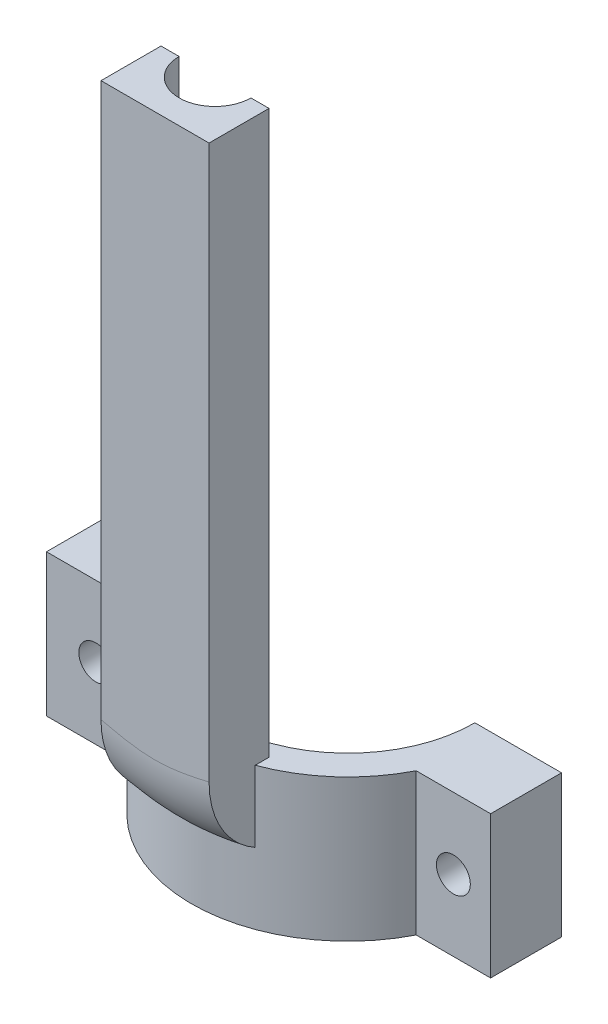
ISO-10303-21;
HEADER;
FILE_DESCRIPTION(('STEP AP214'),'2;1');
FILE_NAME('part.step','',(''),(''),'','','');
FILE_SCHEMA(('AUTOMOTIVE_DESIGN { 1 0 10303 214 1 1 1 1 }'));
ENDSEC;
DATA;
#1=APPLICATION_CONTEXT('core data for automotive mechanical design processes');
#2=APPLICATION_PROTOCOL_DEFINITION('international standard','automotive_design',2000,#1);
#3=PRODUCT_CONTEXT('',#1,'mechanical');
#4=PRODUCT('Part','Part','',(#3));
#5=PRODUCT_RELATED_PRODUCT_CATEGORY('part','',(#4));
#6=PRODUCT_DEFINITION_FORMATION('','',#4);
#7=PRODUCT_DEFINITION_CONTEXT('part definition',#1,'design');
#8=PRODUCT_DEFINITION('design','',#6,#7);
#9=PRODUCT_DEFINITION_SHAPE('','',#8);
#10=(LENGTH_UNIT() NAMED_UNIT(*) SI_UNIT(.MILLI.,.METRE.));
#11=(NAMED_UNIT(*) PLANE_ANGLE_UNIT() SI_UNIT($,.RADIAN.));
#12=(NAMED_UNIT(*) SI_UNIT($,.STERADIAN.) SOLID_ANGLE_UNIT());
#13=UNCERTAINTY_MEASURE_WITH_UNIT(LENGTH_MEASURE(1.E-05),#10,'distance_accuracy_value','');
#14=(GEOMETRIC_REPRESENTATION_CONTEXT(3) GLOBAL_UNCERTAINTY_ASSIGNED_CONTEXT((#13)) GLOBAL_UNIT_ASSIGNED_CONTEXT((#10,
#11,#12)) REPRESENTATION_CONTEXT('',''));
#15=CARTESIAN_POINT('',(0.,0.,0.));
#16=DIRECTION('',(0.,0.,1.));
#17=DIRECTION('',(1.,0.,0.));
#18=AXIS2_PLACEMENT_3D('',#15,#16,#17);
#19=CARTESIAN_POINT('',(0.,16.05,0.));
#20=DIRECTION('',(0.,-1.,0.));
#21=DIRECTION('',(0.,0.,-1.));
#22=AXIS2_PLACEMENT_3D('',#19,#20,#21);
#23=CYLINDRICAL_SURFACE('',#22,17.63);
#24=CARTESIAN_POINT('',(0.,16.05,0.));
#25=DIRECTION('',(0.,1.,0.));
#26=DIRECTION('',(1.,0.,0.));
#27=AXIS2_PLACEMENT_3D('',#24,#25,#26);
#28=CIRCLE('',#27,17.63);
#29=CARTESIAN_POINT('',(-15.9755493799721,16.05,7.45645505639727));
#30=VERTEX_POINT('',#29);
#31=CARTESIAN_POINT('',(-6.095,16.05,16.5429101127945));
#32=VERTEX_POINT('',#31);
#33=EDGE_CURVE('E202',#30,#32,#28,.T.);
#34=ORIENTED_EDGE('',*,*,#33,.F.);
#35=DIRECTION('',(0.,-1.,0.));
#36=VECTOR('',#35,1.);
#37=CARTESIAN_POINT('',(-15.9755493799721,16.05,7.45645505639727));
#38=LINE('',#37,#36);
#39=CARTESIAN_POINT('',(-15.9755493799721,0.,7.45645505639727));
#40=VERTEX_POINT('',#39);
#41=EDGE_CURVE('E221',#30,#40,#38,.T.);
#42=ORIENTED_EDGE('',*,*,#41,.T.);
#43=CARTESIAN_POINT('',(0.,0.,0.));
#44=DIRECTION('',(0.,1.,0.));
#45=DIRECTION('',(1.,0.,0.));
#46=AXIS2_PLACEMENT_3D('',#43,#44,#45);
#47=CIRCLE('',#46,17.63);
#48=CARTESIAN_POINT('',(15.7104073785501,0.,8.));
#49=VERTEX_POINT('',#48);
#50=EDGE_CURVE('E200',#40,#49,#47,.T.);
#51=ORIENTED_EDGE('',*,*,#50,.T.);
#52=DIRECTION('',(0.,-1.,0.));
#53=VECTOR('',#52,1.);
#54=CARTESIAN_POINT('',(15.7104073785501,16.05,8.));
#55=LINE('',#54,#53);
#56=CARTESIAN_POINT('',(15.7104073785501,16.05,8.));
#57=VERTEX_POINT('',#56);
#58=EDGE_CURVE('E204',#49,#57,#55,.F.);
#59=ORIENTED_EDGE('',*,*,#58,.T.);
#60=CARTESIAN_POINT('',(6.095,16.05,16.5429101127945));
#61=VERTEX_POINT('',#60);
#62=EDGE_CURVE('E205',#61,#57,#28,.T.);
#63=ORIENTED_EDGE('',*,*,#62,.F.);
#64=DIRECTION('',(0.,-1.,0.));
#65=VECTOR('',#64,1.);
#66=CARTESIAN_POINT('',(6.095,16.05,16.5429101127945));
#67=LINE('',#66,#65);
#68=CARTESIAN_POINT('',(6.095,8.025,16.5429101127945));
#69=VERTEX_POINT('',#68);
#70=EDGE_CURVE('E215',#61,#69,#67,.T.);
#71=ORIENTED_EDGE('',*,*,#70,.T.);
#72=CARTESIAN_POINT('',(0.,8.025,0.));
#73=DIRECTION('',(0.,-1.,0.));
#74=DIRECTION('',(0.,0.,-1.));
#75=AXIS2_PLACEMENT_3D('',#72,#73,#74);
#76=CIRCLE('',#75,17.63);
#77=CARTESIAN_POINT('',(-6.095,8.025,16.5429101127945));
#78=VERTEX_POINT('',#77);
#79=EDGE_CURVE('E212',#69,#78,#76,.T.);
#80=ORIENTED_EDGE('',*,*,#79,.T.);
#81=DIRECTION('',(0.,-1.,0.));
#82=VECTOR('',#81,1.);
#83=CARTESIAN_POINT('',(-6.095,16.05,16.5429101127945));
#84=LINE('',#83,#82);
#85=EDGE_CURVE('E209',#78,#32,#84,.F.);
#86=ORIENTED_EDGE('',*,*,#85,.T.);
#87=EDGE_LOOP('',(#34,#42,#51,#59,#63,#71,#80,#86));
#88=FACE_BOUND('',#87,.T.);
#89=ADVANCED_FACE('F39',(#88),#23,.T.);
#90=CARTESIAN_POINT('',(0.,16.05,0.));
#91=DIRECTION('',(0.,1.,0.));
#92=DIRECTION('',(0.,0.,1.));
#93=AXIS2_PLACEMENT_3D('',#90,#91,#92);
#94=PLANE('',#93);
#95=DIRECTION('',(1.,0.,0.));
#96=VECTOR('',#95,1.);
#97=CARTESIAN_POINT('',(24.11,16.05,0.));
#98=LINE('',#97,#96);
#99=CARTESIAN_POINT('',(-26.54,16.05,0.));
#100=VERTEX_POINT('',#99);
#101=CARTESIAN_POINT('',(-14.34,16.05,0.));
#102=VERTEX_POINT('',#101);
#103=EDGE_CURVE('E178',#100,#102,#98,.T.);
#104=ORIENTED_EDGE('',*,*,#103,.F.);
#105=DIRECTION('',(0.,0.,-1.));
#106=VECTOR('',#105,1.);
#107=CARTESIAN_POINT('',(-26.54,16.05,-8.54354494360273));
#108=LINE('',#107,#106);
#109=CARTESIAN_POINT('',(-26.54,16.05,7.45645505639727));
#110=VERTEX_POINT('',#109);
#111=EDGE_CURVE('E369',#110,#100,#108,.T.);
#112=ORIENTED_EDGE('',*,*,#111,.F.);
#113=DIRECTION('',(1.,0.,0.));
#114=VECTOR('',#113,1.);
#115=CARTESIAN_POINT('',(-27.75,16.05,7.45645505639727));
#116=LINE('',#115,#114);
#117=EDGE_CURVE('E311',#110,#30,#116,.T.);
#118=ORIENTED_EDGE('',*,*,#117,.T.);
#119=ORIENTED_EDGE('',*,*,#33,.T.);
#120=DIRECTION('',(0.,0.,1.));
#121=VECTOR('',#120,1.);
#122=CARTESIAN_POINT('',(-6.095,16.05,0.));
#123=LINE('',#122,#121);
#124=CARTESIAN_POINT('',(-6.095,16.05,14.98));
#125=VERTEX_POINT('',#124);
#126=EDGE_CURVE('E345',#125,#32,#123,.T.);
#127=ORIENTED_EDGE('',*,*,#126,.F.);
#128=DIRECTION('',(1.,0.,0.));
#129=VECTOR('',#128,1.);
#130=CARTESIAN_POINT('',(0.,16.05,14.98));
#131=LINE('',#130,#129);
#132=CARTESIAN_POINT('',(6.095,16.05,14.98));
#133=VERTEX_POINT('',#132);
#134=EDGE_CURVE('E218',#125,#133,#131,.T.);
#135=ORIENTED_EDGE('',*,*,#134,.T.);
#136=DIRECTION('',(0.,0.,-1.));
#137=VECTOR('',#136,1.);
#138=CARTESIAN_POINT('',(6.095,16.05,0.));
#139=LINE('',#138,#137);
#140=EDGE_CURVE('E323',#61,#133,#139,.T.);
#141=ORIENTED_EDGE('',*,*,#140,.F.);
#142=ORIENTED_EDGE('',*,*,#62,.T.);
#143=DIRECTION('',(1.,0.,0.));
#144=VECTOR('',#143,1.);
#145=CARTESIAN_POINT('',(14.75,16.05,8.));
#146=LINE('',#145,#144);
#147=CARTESIAN_POINT('',(24.11,16.05,8.));
#148=VERTEX_POINT('',#147);
#149=EDGE_CURVE('E186',#57,#148,#146,.T.);
#150=ORIENTED_EDGE('',*,*,#149,.T.);
#151=DIRECTION('',(0.,0.,1.));
#152=VECTOR('',#151,1.);
#153=CARTESIAN_POINT('',(24.11,16.05,-8.));
#154=LINE('',#153,#152);
#155=CARTESIAN_POINT('',(24.11,16.05,0.));
#156=VERTEX_POINT('',#155);
#157=EDGE_CURVE('E184',#156,#148,#154,.T.);
#158=ORIENTED_EDGE('',*,*,#157,.F.);
#159=CARTESIAN_POINT('',(14.34,16.05,0.));
#160=VERTEX_POINT('',#159);
#161=EDGE_CURVE('E161',#160,#156,#98,.T.);
#162=ORIENTED_EDGE('',*,*,#161,.F.);
#163=CARTESIAN_POINT('',(0.,16.05,0.));
#164=DIRECTION('',(0.,1.,0.));
#165=DIRECTION('',(0.,0.,1.));
#166=AXIS2_PLACEMENT_3D('',#163,#164,#165);
#167=CIRCLE('',#166,14.34);
#168=EDGE_CURVE('E197',#102,#160,#167,.T.);
#169=ORIENTED_EDGE('',*,*,#168,.F.);
#170=EDGE_LOOP('',(#104,#112,#118,#119,#127,#135,#141,#142,#150,#158,#162,#169));
#171=FACE_BOUND('',#170,.T.);
#172=ADVANCED_FACE('F292',(#171),#94,.T.);
#173=CARTESIAN_POINT('',(0.,0.,0.));
#174=DIRECTION('',(0.,1.,0.));
#175=DIRECTION('',(0.,0.,1.));
#176=AXIS2_PLACEMENT_3D('',#173,#174,#175);
#177=PLANE('',#176);
#178=DIRECTION('',(0.,0.,-1.));
#179=VECTOR('',#178,1.);
#180=CARTESIAN_POINT('',(-26.54,0.,-8.54354494360273));
#181=LINE('',#180,#179);
#182=CARTESIAN_POINT('',(-26.54,0.,7.45645505639727));
#183=VERTEX_POINT('',#182);
#184=CARTESIAN_POINT('',(-26.54,0.,0.));
#185=VERTEX_POINT('',#184);
#186=EDGE_CURVE('E368',#183,#185,#181,.T.);
#187=ORIENTED_EDGE('',*,*,#186,.T.);
#188=DIRECTION('',(1.,0.,0.));
#189=VECTOR('',#188,1.);
#190=CARTESIAN_POINT('',(24.11,0.,0.));
#191=LINE('',#190,#189);
#192=CARTESIAN_POINT('',(-14.34,0.,0.));
#193=VERTEX_POINT('',#192);
#194=EDGE_CURVE('E166',#185,#193,#191,.T.);
#195=ORIENTED_EDGE('',*,*,#194,.T.);
#196=CARTESIAN_POINT('',(0.,0.,0.));
#197=DIRECTION('',(0.,1.,0.));
#198=DIRECTION('',(0.,0.,1.));
#199=AXIS2_PLACEMENT_3D('',#196,#197,#198);
#200=CIRCLE('',#199,14.34);
#201=CARTESIAN_POINT('',(14.34,0.,0.));
#202=VERTEX_POINT('',#201);
#203=EDGE_CURVE('E177',#193,#202,#200,.T.);
#204=ORIENTED_EDGE('',*,*,#203,.T.);
#205=CARTESIAN_POINT('',(24.11,0.,0.));
#206=VERTEX_POINT('',#205);
#207=EDGE_CURVE('E158',#202,#206,#191,.T.);
#208=ORIENTED_EDGE('',*,*,#207,.T.);
#209=DIRECTION('',(0.,0.,1.));
#210=VECTOR('',#209,1.);
#211=CARTESIAN_POINT('',(24.11,0.,-8.));
#212=LINE('',#211,#210);
#213=CARTESIAN_POINT('',(24.11,0.,8.));
#214=VERTEX_POINT('',#213);
#215=EDGE_CURVE('E173',#206,#214,#212,.T.);
#216=ORIENTED_EDGE('',*,*,#215,.T.);
#217=DIRECTION('',(1.,0.,0.));
#218=VECTOR('',#217,1.);
#219=CARTESIAN_POINT('',(14.75,0.,8.));
#220=LINE('',#219,#218);
#221=EDGE_CURVE('E193',#49,#214,#220,.T.);
#222=ORIENTED_EDGE('',*,*,#221,.F.);
#223=ORIENTED_EDGE('',*,*,#50,.F.);
#224=DIRECTION('',(1.,0.,0.));
#225=VECTOR('',#224,1.);
#226=CARTESIAN_POINT('',(-27.75,0.,7.45645505639727));
#227=LINE('',#226,#225);
#228=EDGE_CURVE('E313',#183,#40,#227,.T.);
#229=ORIENTED_EDGE('',*,*,#228,.F.);
#230=EDGE_LOOP('',(#187,#195,#204,#208,#216,#222,#223,#229));
#231=FACE_BOUND('',#230,.T.);
#232=ADVANCED_FACE('F171',(#231),#177,.F.);
#233=CARTESIAN_POINT('',(0.,16.05,0.));
#234=DIRECTION('',(0.,-1.,0.));
#235=DIRECTION('',(0.,0.,-1.));
#236=AXIS2_PLACEMENT_3D('',#233,#234,#235);
#237=CYLINDRICAL_SURFACE('',#236,14.34);
#238=DIRECTION('',(0.,-1.,0.));
#239=VECTOR('',#238,1.);
#240=CARTESIAN_POINT('',(-14.34,16.05,0.));
#241=LINE('',#240,#239);
#242=EDGE_CURVE('E382',#102,#193,#241,.T.);
#243=ORIENTED_EDGE('',*,*,#242,.F.);
#244=ORIENTED_EDGE('',*,*,#168,.T.);
#245=DIRECTION('',(0.,-1.,0.));
#246=VECTOR('',#245,1.);
#247=CARTESIAN_POINT('',(14.34,16.05,0.));
#248=LINE('',#247,#246);
#249=EDGE_CURVE('E384',#202,#160,#248,.F.);
#250=ORIENTED_EDGE('',*,*,#249,.F.);
#251=ORIENTED_EDGE('',*,*,#203,.F.);
#252=EDGE_LOOP('',(#243,#244,#250,#251));
#253=FACE_BOUND('',#252,.T.);
#254=ADVANCED_FACE('F287',(#253),#237,.F.);
#255=CARTESIAN_POINT('',(14.75,16.05,8.));
#256=DIRECTION('',(0.,0.,1.));
#257=DIRECTION('',(1.,0.,0.));
#258=AXIS2_PLACEMENT_3D('',#255,#256,#257);
#259=PLANE('',#258);
#260=CARTESIAN_POINT('',(19.9102036892766,8.02500000000175,8.));
#261=DIRECTION('',(0.,0.,1.));
#262=DIRECTION('',(1.,0.,0.));
#263=AXIS2_PLACEMENT_3D('',#260,#261,#262);
#264=CIRCLE('',#263,1.91);
#265=CARTESIAN_POINT('',(21.8202036892766,8.02500000000175,8.));
#266=VERTEX_POINT('',#265);
#267=EDGE_CURVE('E188',#266,#266,#264,.T.);
#268=ORIENTED_EDGE('',*,*,#267,.F.);
#269=EDGE_LOOP('',(#268));
#270=FACE_BOUND('',#269,.T.);
#271=DIRECTION('',(0.,1.,0.));
#272=VECTOR('',#271,1.);
#273=CARTESIAN_POINT('',(24.11,0.,8.));
#274=LINE('',#273,#272);
#275=EDGE_CURVE('E182',#214,#148,#274,.T.);
#276=ORIENTED_EDGE('',*,*,#275,.T.);
#277=ORIENTED_EDGE('',*,*,#149,.F.);
#278=ORIENTED_EDGE('',*,*,#58,.F.);
#279=ORIENTED_EDGE('',*,*,#221,.T.);
#280=EDGE_LOOP('',(#276,#277,#278,#279));
#281=FACE_BOUND('',#280,.T.);
#282=ADVANCED_FACE('F284',(#270,#281),#259,.T.);
#283=CARTESIAN_POINT('',(24.11,0.,-8.));
#284=DIRECTION('',(-1.,0.,0.));
#285=DIRECTION('',(0.,0.,1.));
#286=AXIS2_PLACEMENT_3D('',#283,#284,#285);
#287=PLANE('',#286);
#288=ORIENTED_EDGE('',*,*,#215,.F.);
#289=DIRECTION('',(0.,1.,0.));
#290=VECTOR('',#289,1.);
#291=CARTESIAN_POINT('',(24.11,0.,0.));
#292=LINE('',#291,#290);
#293=EDGE_CURVE('E154',#206,#156,#292,.T.);
#294=ORIENTED_EDGE('',*,*,#293,.T.);
#295=ORIENTED_EDGE('',*,*,#157,.T.);
#296=ORIENTED_EDGE('',*,*,#275,.F.);
#297=EDGE_LOOP('',(#288,#294,#295,#296));
#298=FACE_BOUND('',#297,.T.);
#299=ADVANCED_FACE('F180',(#298),#287,.F.);
#300=CARTESIAN_POINT('',(19.9102036892766,8.02500000000175,-17.63));
#301=DIRECTION('',(0.,0.,1.));
#302=DIRECTION('',(1.,0.,0.));
#303=AXIS2_PLACEMENT_3D('',#300,#301,#302);
#304=CYLINDRICAL_SURFACE('',#303,1.91);
#305=CARTESIAN_POINT('',(19.9102036892766,8.02500000000175,0.));
#306=DIRECTION('',(0.,0.,1.));
#307=DIRECTION('',(1.,0.,0.));
#308=AXIS2_PLACEMENT_3D('',#305,#306,#307);
#309=CIRCLE('',#308,1.91);
#310=CARTESIAN_POINT('',(21.8202036892766,8.02500000000175,0.));
#311=VERTEX_POINT('',#310);
#312=EDGE_CURVE('E386',#311,#311,#309,.F.);
#313=ORIENTED_EDGE('',*,*,#312,.T.);
#314=EDGE_LOOP('',(#313));
#315=FACE_BOUND('',#314,.T.);
#316=ORIENTED_EDGE('',*,*,#267,.T.);
#317=EDGE_LOOP('',(#316));
#318=FACE_BOUND('',#317,.T.);
#319=ADVANCED_FACE('F277',(#315,#318),#304,.F.);
#320=CARTESIAN_POINT('',(6.095,16.2886259485937,14.98));
#321=DIRECTION('',(1.,0.,0.));
#322=DIRECTION('',(0.,1.,0.));
#323=AXIS2_PLACEMENT_3D('',#320,#321,#322);
#324=PLANE('',#323);
#325=DIRECTION('',(0.,1.,0.));
#326=VECTOR('',#325,1.);
#327=CARTESIAN_POINT('',(6.095,16.2886259485937,21.75));
#328=LINE('',#327,#326);
#329=CARTESIAN_POINT('',(6.095,17.0082814691157,21.75));
#330=VERTEX_POINT('',#329);
#331=CARTESIAN_POINT('',(6.095,79.4486259485936,21.75));
#332=VERTEX_POINT('',#331);
#333=EDGE_CURVE('E326',#330,#332,#328,.T.);
#334=ORIENTED_EDGE('',*,*,#333,.F.);
#335=CARTESIAN_POINT('',(7.55626955288261,17.3311317481145,21.75));
#336=CARTESIAN_POINT('',(9.06998044403518,10.2154967102555,21.75));
#337=CARTESIAN_POINT('',(9.53596537857802,8.025,14.828427573366));
#338=CARTESIAN_POINT('',(7.39771554042295,17.2974052620166,21.75));
#339=CARTESIAN_POINT('',(8.91443682423131,10.2569446623514,21.75));
#340=CARTESIAN_POINT('',(9.3944165999827,8.025,14.9194515991595));
#341=CARTESIAN_POINT('',(7.23929058979263,17.2630825114387,21.75));
#342=CARTESIAN_POINT('',(8.75547247452675,10.2966027644712,21.75));
#343=CARTESIAN_POINT('',(9.24906290654887,8.025,15.0100660131043));
#344=CARTESIAN_POINT('',(6.92262327581077,17.1936176683855,21.75));
#345=CARTESIAN_POINT('',(8.43200360249445,10.3720740804519,21.75));
#346=CARTESIAN_POINT('',(8.95052788950335,8.025,15.1899752924176));
#347=CARTESIAN_POINT('',(6.76438090900696,17.1584755916773,21.75));
#348=CARTESIAN_POINT('',(8.26750952509677,10.407919341787,21.75));
#349=CARTESIAN_POINT('',(8.79734671645734,8.025,15.2792701831251));
#350=CARTESIAN_POINT('',(6.28975199182806,17.0523662347522,21.75));
#351=CARTESIAN_POINT('',(7.76757628664379,10.5095051617129,21.75));
#352=CARTESIAN_POINT('',(8.32567398721923,8.025,15.5444601090843));
#353=CARTESIAN_POINT('',(5.97351694868253,16.9807274324792,21.75));
#354=CARTESIAN_POINT('',(7.42250217031686,10.5701242689137,21.75));
#355=CARTESIAN_POINT('',(7.9951007240694,8.025,15.7176294193247));
#356=CARTESIAN_POINT('',(5.33825980212506,16.8383930088284,21.75));
#357=CARTESIAN_POINT('',(6.70998681401572,10.6777597097154,21.75));
#358=CARTESIAN_POINT('',(7.29790372012117,8.025,16.0532947541033));
#359=CARTESIAN_POINT('',(5.01923506564786,16.7677089734387,21.75));
#360=CARTESIAN_POINT('',(6.34221618464083,10.724896279597,21.75));
#361=CARTESIAN_POINT('',(6.93102084203835,8.025,16.2156978319138));
#362=CARTESIAN_POINT('',(4.38006064164241,16.6315780262785,21.75));
#363=CARTESIAN_POINT('',(5.58859628084924,10.8065062063966,21.75));
#364=CARTESIAN_POINT('',(6.16336856796635,8.025,16.5227286114624));
#365=CARTESIAN_POINT('',(4.05991100037761,16.5661309017038,21.75));
#366=CARTESIAN_POINT('',(5.20242052459039,10.8411674909792,21.75));
#367=CARTESIAN_POINT('',(5.76260055027696,8.025,16.6673570356094));
#368=CARTESIAN_POINT('',(3.43008574111318,16.4467905484334,21.75));
#369=CARTESIAN_POINT('',(4.42914457692444,10.8985545530458,21.75));
#370=CARTESIAN_POINT('',(4.94488036228615,8.025,16.9275494422037));
#371=CARTESIAN_POINT('',(3.12047700665392,16.3925515502081,21.75));
#372=CARTESIAN_POINT('',(4.04228662958956,10.9218074004229,21.75));
#373=CARTESIAN_POINT('',(4.52913062767871,8.025,17.0440124017182));
#374=CARTESIAN_POINT('',(2.49933867035201,16.2962048220794,21.75));
#375=CARTESIAN_POINT('',(3.25653719948979,10.9599956964683,21.75));
#376=CARTESIAN_POINT('',(3.67174659103571,8.025,17.2490366440128));
#377=CARTESIAN_POINT('',(2.18780911466595,16.2540968018249,21.75));
#378=CARTESIAN_POINT('',(2.85699242347863,10.9750220145543,21.75));
#379=CARTESIAN_POINT('',(3.23011290882901,8.025,17.3375985945996));
#380=CARTESIAN_POINT('',(1.56405941212599,16.1853433212023,21.75));
#381=CARTESIAN_POINT('',(2.05074068516762,10.998243788931,21.75));
#382=CARTESIAN_POINT('',(2.32888449649572,8.025,17.4814357265635));
#383=CARTESIAN_POINT('',(1.25184504572983,16.1586466933803,21.75));
#384=CARTESIAN_POINT('',(1.64325308418064,11.0065171770577,21.75));
#385=CARTESIAN_POINT('',(1.86935467227485,8.025,17.5368210810845));
#386=CARTESIAN_POINT('',(0.626411767165124,16.1227857445904,21.75));
#387=CARTESIAN_POINT('',(0.824293614530136,11.0173970545462,21.75));
#388=CARTESIAN_POINT('',(0.939871228853534,8.025,17.6110927961328));
#389=CARTESIAN_POINT('',(0.313193000756705,16.1136189856068,21.75));
#390=CARTESIAN_POINT('',(0.411886906455081,11.0200301556064,21.75));
#391=CARTESIAN_POINT('',(0.469919068366966,8.025,17.6299842321582));
#392=CARTESIAN_POINT('',(-0.199720683680022,16.1136030822573,21.75));
#393=CARTESIAN_POINT('',(-0.262657100293546,11.0200243457878,21.75));
#394=CARTESIAN_POINT('',(-0.299664096632133,8.025,17.6300100550272));
#395=CARTESIAN_POINT('',(-0.399430889728444,16.1173206137935,21.75));
#396=CARTESIAN_POINT('',(-0.525428700628266,11.0189502639892,21.75));
#397=CARTESIAN_POINT('',(-0.599314574321163,8.025,17.6223442981007));
#398=CARTESIAN_POINT('',(-0.798576475493922,16.1320381464703,21.75));
#399=CARTESIAN_POINT('',(-1.04943154553976,11.0145898902614,21.75));
#400=CARTESIAN_POINT('',(-1.19587505235678,8.025,17.5919268744249));
#401=CARTESIAN_POINT('',(-0.998011866610588,16.143037835833,21.75));
#402=CARTESIAN_POINT('',(-1.31091124268695,11.011299489796,21.75));
#403=CARTESIAN_POINT('',(-1.49278516947721,8.025,17.5691758535352));
#404=CARTESIAN_POINT('',(-1.3965479598114,16.171942393114,21.75));
#405=CARTESIAN_POINT('',(-1.8313576001908,11.0023277556035,21.75));
#406=CARTESIAN_POINT('',(-2.08156551475882,8.025,17.5091880952562));
#407=CARTESIAN_POINT('',(-1.59564822293016,16.1898532281806,21.75));
#408=CARTESIAN_POINT('',(-2.09055680915935,10.9966356630528,21.75));
#409=CARTESIAN_POINT('',(-2.37343115932557,8.025,17.4719388397117));
#410=CARTESIAN_POINT('',(-1.9931792270486,16.231962237468,21.75));
#411=CARTESIAN_POINT('',(-2.60514931741453,10.9825809016424,21.75));
#412=CARTESIAN_POINT('',(-2.94962228746307,8.025,17.3839459145595));
#413=CARTESIAN_POINT('',(-2.19160995647406,16.2561605198213,21.75));
#414=CARTESIAN_POINT('',(-2.8607569403483,10.9742045214045,21.75));
#415=CARTESIAN_POINT('',(-3.23394764126176,8.025,17.3332020128678));
#416=CARTESIAN_POINT('',(-2.58908368943176,16.3102555188312,21.75));
#417=CARTESIAN_POINT('',(-3.36901289669369,10.954359562476,21.75));
#418=CARTESIAN_POINT('',(-3.79515104298269,8.025,17.2190681855553));
#419=CARTESIAN_POINT('',(-2.78812143187283,16.3401904995644,21.75));
#420=CARTESIAN_POINT('',(-3.62181368275882,10.9428507579961,21.75));
#421=CARTESIAN_POINT('',(-4.07196396213032,8.025,17.1555932023727));
#422=CARTESIAN_POINT('',(-3.18542735993,16.4047555464746,21.75));
#423=CARTESIAN_POINT('',(-4.12187308157776,10.9163604596518,21.75));
#424=CARTESIAN_POINT('',(-4.61465355373021,8.025,17.0176459787946));
#425=CARTESIAN_POINT('',(-3.38369554261517,16.4393856305152,21.75));
#426=CARTESIAN_POINT('',(-4.3692943620734,10.901353316227,21.75));
#427=CARTESIAN_POINT('',(-4.88053018456764,8.025,16.9431736965571));
#428=CARTESIAN_POINT('',(-3.77957040391945,16.5124067174858,21.75));
#429=CARTESIAN_POINT('',(-4.85802469223823,10.867435299253,21.75));
#430=CARTESIAN_POINT('',(-5.40039745306973,8.025,16.784709826125));
#431=CARTESIAN_POINT('',(-3.97717695128512,16.5507984256492,21.75));
#432=CARTESIAN_POINT('',(-5.09946458343049,10.8484917117711,21.75));
#433=CARTESIAN_POINT('',(-5.6543858486744,8.025,16.7007164524408));
#434=CARTESIAN_POINT('',(-4.37182491176672,16.6303962985974,21.75));
#435=CARTESIAN_POINT('',(-5.57570057546399,10.8062828239579,21.75));
#436=CARTESIAN_POINT('',(-6.14982867776761,8.025,16.5246973059131));
#437=CARTESIAN_POINT('',(-4.56886630639206,16.6716025543979,21.75));
#438=CARTESIAN_POINT('',(-5.81059882905939,10.7829790536945,21.75));
#439=CARTESIAN_POINT('',(-6.39128270547979,8.025,16.4326712732857));
#440=CARTESIAN_POINT('',(-5.15107855511876,16.7962698398346,21.75));
#441=CARTESIAN_POINT('',(-6.49703198566357,10.7068092376028,21.75));
#442=CARTESIAN_POINT('',(-7.0864146706462,8.025,16.1507348173653));
#443=CARTESIAN_POINT('',(-5.5356711578741,16.8823993743803,21.75));
#444=CARTESIAN_POINT('',(-6.93677153103515,10.6472167545853,21.75));
#445=CARTESIAN_POINT('',(-7.52184658137942,8.025,15.9514963966255));
#446=CARTESIAN_POINT('',(-6.30468467143927,17.055445929499,21.75));
#447=CARTESIAN_POINT('',(-7.78613276338141,10.5075069630125,21.75));
#448=CARTESIAN_POINT('',(-8.34368857072315,8.025,15.537428550945));
#449=CARTESIAN_POINT('',(-6.68910557466056,17.14236298184,21.75));
#450=CARTESIAN_POINT('',(-8.19592343670656,10.426978060865,21.75));
#451=CARTESIAN_POINT('',(-8.73009666222003,8.025,15.322598494573));
#452=CARTESIAN_POINT('',(-7.45840504363332,17.3111771227083,21.75));
#453=CARTESIAN_POINT('',(-8.98217857346139,10.2438854063504,21.75));
#454=CARTESIAN_POINT('',(-9.4559101612477,8.025,14.885624826792));
#455=CARTESIAN_POINT('',(-7.84328179164102,17.3930823013564,21.75));
#456=CARTESIAN_POINT('',(-9.35855688742882,10.1408970541267,21.75));
#457=CARTESIAN_POINT('',(-9.79539249452647,8.025,14.6634939419148));
#458=CARTESIAN_POINT('',(-8.61505416044897,17.547062096293,21.75));
#459=CARTESIAN_POINT('',(-10.0758385341219,9.91215304318211,21.75));
#460=CARTESIAN_POINT('',(-10.4317649101368,8.025,14.2178097566625));
#461=CARTESIAN_POINT('',(-9.00194986639983,17.6191362944183,21.75));
#462=CARTESIAN_POINT('',(-10.4163163315006,9.78592236719907,21.75));
#463=CARTESIAN_POINT('',(-10.7286531807469,8.025,13.9942563962051));
#464=CARTESIAN_POINT('',(-9.77272832830718,17.7481078612336,21.75));
#465=CARTESIAN_POINT('',(-11.053804913418,9.51318956106261,21.75));
#466=CARTESIAN_POINT('',(-11.2799903746169,8.025,13.5536515869962));
#467=CARTESIAN_POINT('',(-10.1565770519467,17.8052042201563,21.75));
#468=CARTESIAN_POINT('',(-11.3508086216022,9.36652747328558,21.75));
#469=CARTESIAN_POINT('',(-11.5349769211982,8.025,13.3365529166556));
#470=CARTESIAN_POINT('',(-10.9264150867178,17.9016768946696,21.75));
#471=CARTESIAN_POINT('',(-11.9033443709049,9.05339377154784,21.75));
#472=CARTESIAN_POINT('',(-12.0113437358514,8.025,12.9091778510755));
#473=CARTESIAN_POINT('',(-11.312403665486,17.9410589345921,21.75));
#474=CARTESIAN_POINT('',(-12.1580822595451,8.88655738528693,21.75));
#475=CARTESIAN_POINT('',(-12.2327348448471,8.025,12.6988992723536));
#476=CARTESIAN_POINT('',(-12.0892714660198,17.998867118539,21.75));
#477=CARTESIAN_POINT('',(-12.6244782177249,8.53463879535073,21.75));
#478=CARTESIAN_POINT('',(-12.6475269834334,8.025,12.2858996517728));
#479=CARTESIAN_POINT('',(-12.4801646538888,18.0171161130591,21.75));
#480=CARTESIAN_POINT('',(-12.8347498347657,8.34916733555532,21.75));
#481=CARTESIAN_POINT('',(-12.840679707258,8.025,12.0832560805929));
#482=CARTESIAN_POINT('',(-13.0670106573835,18.0258814500737,21.75));
#483=CARTESIAN_POINT('',(-13.111833686796,8.0630191821243,21.75));
#484=CARTESIAN_POINT('',(-13.1105285482928,8.025,11.787651373043));
#485=CARTESIAN_POINT('',(-13.2628457054136,18.0256953018747,21.75));
#486=CARTESIAN_POINT('',(-13.1983242869155,7.96552287366578,21.75));
#487=CARTESIAN_POINT('',(-13.19721774212,8.025,11.6904457126801));
#488=CARTESIAN_POINT('',(-13.6544305429402,18.0187297178534,21.75));
#489=CARTESIAN_POINT('',(-13.358412562898,7.76815890792759,21.75));
#490=CARTESIAN_POINT('',(-13.3643511763718,8.025,11.4990056947333));
#491=CARTESIAN_POINT('',(-13.8501803116317,18.0119491330488,21.75));
#492=CARTESIAN_POINT('',(-13.4318680036584,7.66828401941616,21.75));
#493=CARTESIAN_POINT('',(-13.4447943258786,8.025,11.4047718578995));
#494=CARTESIAN_POINT('',(-14.0457712312151,18.0016852418244,21.75));
#495=CARTESIAN_POINT('',(-13.4983490522466,7.56812099702314,21.75));
#496=CARTESIAN_POINT('',(-13.522320313981,8.025,11.3121064937569));
#497=(BOUNDED_SURFACE() B_SPLINE_SURFACE(3,2,((#335,#336,#337),(#338,#339,#340),(#341,#342,
#343),(#344,#345,#346),(#347,#348,#349),(#350,#351,#352),(#353,#354,#355),(#356,#357,#358),
(#359,#360,#361),(#362,#363,#364),(#365,#366,#367),(#368,#369,#370),(#371,#372,#373),(#374,#375,
#376),(#377,#378,#379),(#380,#381,#382),(#383,#384,#385),(#386,#387,#388),(#389,#390,#391),
(#392,#393,#394),(#395,#396,#397),(#398,#399,#400),(#401,#402,#403),(#404,#405,#406),(#407,#408,
#409),(#410,#411,#412),(#413,#414,#415),(#416,#417,#418),(#419,#420,#421),(#422,#423,#424),
(#425,#426,#427),(#428,#429,#430),(#431,#432,#433),(#434,#435,#436),(#437,#438,#439),(#440,#441,
#442),(#443,#444,#445),(#446,#447,#448),(#449,#450,#451),(#452,#453,#454),(#455,#456,#457),
(#458,#459,#460),(#461,#462,#463),(#464,#465,#466),(#467,#468,#469),(#470,#471,#472),(#473,#474,
#475),(#476,#477,#478),(#479,#480,#481),(#482,#483,#484),(#485,#486,#487),(#488,#489,#490),
(#491,#492,#493),(#494,#495,#496)),.UNSPECIFIED.,.F.,.F.,.F.) B_SPLINE_SURFACE_WITH_KNOTS((4,2,
2,2,2,2,2,2,2,2,2,2,2,2,2,2,2,2,2,2,2,2,2,2,2,2,4),(3,3),(0.,0.486299981300154,
0.972590611883624,1.94533558499113,2.92560678786236,3.90583813673826,4.84863754378603,
5.79141438334463,6.73104282990805,7.67054058549563,8.26965082617294,8.86873541823837,
9.46833842719843,10.0679517489279,10.6717132411317,11.27547703056,11.8793542316773,
12.4832509699966,13.6655812075433,14.8479593539322,16.0283756298436,17.208842099415,
18.3727245045414,19.5362305336966,20.7094207194916,21.2968272462616,21.8843361382052),(0.,1.),
.UNSPECIFIED.) GEOMETRIC_REPRESENTATION_ITEM() RATIONAL_B_SPLINE_SURFACE(((1.,0.808654053763598,
1.),(1.,0.811468176504175,1.),(1.,0.814254809872224,1.),(1.,0.819759917892714,1.),(1.,
0.822478393854699,1.),(1.,0.830512879072206,1.),(1.,0.83570698944805,1.),(1.,0.845688983869504,
1.),(1.,0.850473413965501,1.),(1.,0.859451334178301,1.),(1.,0.863644848312506,1.),(1.,
0.871143515024104,1.),(1.,0.8744764761965,1.),(1.,0.880318356417514,1.),(1.,0.882827295189057,
1.),(1.,0.886891166007754,1.),(1.,0.888449255969825,1.),(1.,0.890536800054764,1.),(1.,
0.891066397218319,1.),(1.,0.891067018197567,1.),(1.,0.890852052901668,1.),(1.,0.889998057930476,
1.),(1.,0.889359046410271,1.),(1.,0.887671171343632,1.),(1.,0.886621953610913,1.),(1.,
0.884137339863164,1.),(1.,0.882701937206439,1.),(1.,0.879463497673715,1.),(1.,0.877657986174328,
1.),(1.,0.8737197338269,1.),(1.,0.871586991733823,1.),(1.,0.867029800955069,1.),(1.,
0.864605297550139,1.),(1.,0.859500666663324,1.),(1.,0.856820530913787,1.),(1.,0.848567287943589,
1.),(1.,0.842682076522989,1.),(1.,0.830307013324734,1.),(1.,0.823817137056295,1.),(1.,
0.810447936986082,1.),(1.,0.80356927724579,1.),(1.,0.789581804685792,1.),(1.,0.782472982091954,
1.),(1.,0.768265812029272,1.),(1.,0.761168720445459,1.),(1.,0.747000062138011,1.),(1.,
0.739928487902329,1.),(1.,0.725840899088303,1.),(1.,0.71882583684148,1.),(1.,0.708445197666972,
1.),(1.,0.705006319204928,1.),(1.,0.698184737189076,1.),(1.,0.694802043529097,1.),(1.,
0.691451606902352,1.))) REPRESENTATION_ITEM('') SURFACE());
#498=CARTESIAN_POINT('',(6.09499999999999,17.0082814691157,21.75));
#499=CARTESIAN_POINT('',(6.09499999999999,16.7150204898362,21.7500250325944));
#500=CARTESIAN_POINT('',(6.095,16.4217603530142,21.737723516458));
#501=CARTESIAN_POINT('',(6.095,15.837291491594,21.688645134657));
#502=CARTESIAN_POINT('',(6.095,15.5460827930033,21.6518679592605));
#503=CARTESIAN_POINT('',(6.095,14.9679466180673,21.5540452124149));
#504=CARTESIAN_POINT('',(6.095,14.6810166905574,21.4930141365226));
#505=CARTESIAN_POINT('',(6.095,14.1133089442814,21.3470413775567));
#506=CARTESIAN_POINT('',(6.095,13.8325309944686,21.2621002043407));
#507=CARTESIAN_POINT('',(6.095,13.2788825825639,21.0687106322152));
#508=CARTESIAN_POINT('',(6.095,13.0060200072598,20.960239642866));
#509=CARTESIAN_POINT('',(6.095,12.4703786266764,20.720442208458));
#510=CARTESIAN_POINT('',(6.095,12.2076044076091,20.5891055152578));
#511=CARTESIAN_POINT('',(6.095,11.6943602754742,20.3044963295668));
#512=CARTESIAN_POINT('',(6.095,11.4438849981619,20.1512335164886));
#513=CARTESIAN_POINT('',(6.095,10.9571576782178,19.8238064156766));
#514=CARTESIAN_POINT('',(6.095,10.720899353589,19.6496514628419));
#515=CARTESIAN_POINT('',(6.095,10.2434789796002,19.264732455101));
#516=CARTESIAN_POINT('',(6.095,10.0038365130903,19.0520779534523));
#517=CARTESIAN_POINT('',(6.095,9.54583378465096,18.6049580976212));
#518=CARTESIAN_POINT('',(6.095,9.32747519940152,18.3704910279495));
#519=CARTESIAN_POINT('',(6.095,8.91328194554912,17.8806831525215));
#520=CARTESIAN_POINT('',(6.095,8.71754466287883,17.625259641446));
#521=CARTESIAN_POINT('',(6.095,8.44315701448306,17.2289214656124));
#522=CARTESIAN_POINT('',(6.095,8.3548807187467,17.0945781652037));
#523=CARTESIAN_POINT('',(6.095,8.18493639724828,16.8217685227644));
#524=CARTESIAN_POINT('',(6.095,8.10326860333008,16.6833020363144));
#525=CARTESIAN_POINT('',(6.095,8.02499999999972,16.5429101127949));
#526=B_SPLINE_CURVE_WITH_KNOTS('',3,(#498,#499,#500,#501,#502,#503,#504,#505,#506,#507,#508,
#509,#510,#511,#512,#513,#514,#515,#516,#517,#518,#519,#520,#521,#522,#523,#524,#525),
.UNSPECIFIED.,.F.,.F.,(4,2,2,2,2,2,2,2,2,2,2,2,2,4),(0.,0.879524555488891,1.75906024130243,
2.63807105353808,3.51706312321794,4.39690285791604,5.27713794645024,6.15698564236634,
7.0364416641582,7.99614408995665,8.95592205722104,9.91968905779193,10.4017784361083,
10.8838847200806),.UNSPECIFIED.);
#527=EDGE_CURVE('E51',#330,#69,#526,.T.);
#528=ORIENTED_EDGE('',*,*,#527,.T.);
#529=ORIENTED_EDGE('',*,*,#70,.F.);
#530=ORIENTED_EDGE('',*,*,#140,.T.);
#531=DIRECTION('',(0.,1.,0.));
#532=VECTOR('',#531,1.);
#533=CARTESIAN_POINT('',(6.095,16.2886259485937,14.98));
#534=LINE('',#533,#532);
#535=CARTESIAN_POINT('',(6.095,79.4486259485936,14.98));
#536=VERTEX_POINT('',#535);
#537=EDGE_CURVE('E334',#133,#536,#534,.T.);
#538=ORIENTED_EDGE('',*,*,#537,.T.);
#539=DIRECTION('',(0.,0.,-1.));
#540=VECTOR('',#539,1.);
#541=CARTESIAN_POINT('',(6.095,79.4486259485936,21.75));
#542=LINE('',#541,#540);
#543=EDGE_CURVE('E331',#332,#536,#542,.T.);
#544=ORIENTED_EDGE('',*,*,#543,.F.);
#545=EDGE_LOOP('',(#334,#528,#529,#530,#538,#544));
#546=FACE_BOUND('',#545,.T.);
#547=ADVANCED_FACE('F272',(#546),#324,.T.);
#548=CARTESIAN_POINT('',(-6.095,16.2886259485937,14.98));
#549=DIRECTION('',(-1.,0.,0.));
#550=DIRECTION('',(0.,-1.,0.));
#551=AXIS2_PLACEMENT_3D('',#548,#549,#550);
#552=PLANE('',#551);
#553=ORIENTED_EDGE('',*,*,#85,.F.);
#554=CARTESIAN_POINT('',(-6.095,8.025,16.5429101127945));
#555=CARTESIAN_POINT('',(-6.095,8.1630683543602,16.7906324664677));
#556=CARTESIAN_POINT('',(-6.095,8.31180568299865,17.0323896756263));
#557=CARTESIAN_POINT('',(-6.095,8.62930547086317,17.5023251226709));
#558=CARTESIAN_POINT('',(-6.095,8.79806486607201,17.7305054302532));
#559=CARTESIAN_POINT('',(-6.095,9.1539793172394,18.1712697165823));
#560=CARTESIAN_POINT('',(-6.095,9.34109654607571,18.3838842529094));
#561=CARTESIAN_POINT('',(-6.095,9.73257220714932,18.7925989054629));
#562=CARTESIAN_POINT('',(-6.095,9.93693083648074,18.9886988328522));
#563=CARTESIAN_POINT('',(-6.095,10.3613150156738,19.3630583210832));
#564=CARTESIAN_POINT('',(-6.095,10.5813378467477,19.5413209650302));
#565=CARTESIAN_POINT('',(-6.095,11.0354645152563,19.8789160134715));
#566=CARTESIAN_POINT('',(-6.095,11.2695688902712,20.0382476945615));
#567=CARTESIAN_POINT('',(-6.095,11.750317153073,20.3370897957564));
#568=CARTESIAN_POINT('',(-6.095,11.9969692977521,20.4765869288033));
#569=CARTESIAN_POINT('',(-6.095,12.5009109702211,20.7347937976163));
#570=CARTESIAN_POINT('',(-6.095,12.7582002270912,20.8535040624066));
#571=CARTESIAN_POINT('',(-6.095,13.2861795591445,21.0713394670992));
#572=CARTESIAN_POINT('',(-6.095,13.5570247753777,21.1700886105527));
#573=CARTESIAN_POINT('',(-6.095,14.1059646676702,21.3447932369583));
#574=CARTESIAN_POINT('',(-6.095,14.3840592536388,21.4207490030255));
#575=CARTESIAN_POINT('',(-6.095,14.9451154463096,21.5493448177101));
#576=CARTESIAN_POINT('',(-6.095,15.2280687599897,21.6020211493533));
#577=CARTESIAN_POINT('',(-6.095,15.7972298939905,21.6839207710747));
#578=CARTESIAN_POINT('',(-6.095,16.0834357847028,21.7131572984882));
#579=CARTESIAN_POINT('',(-6.095,16.476549611779,21.7370770967727));
#580=CARTESIAN_POINT('',(-6.095,16.5829122427251,21.7419260954486));
#581=CARTESIAN_POINT('',(-6.095,16.7956066516709,21.7483852561576));
#582=CARTESIAN_POINT('',(-6.095,16.9019383105402,21.7499993405652));
#583=CARTESIAN_POINT('',(-6.095,17.0082814691157,21.75));
#584=B_SPLINE_CURVE_WITH_KNOTS('',3,(#554,#555,#556,#557,#558,#559,#560,#561,#562,#563,#564,
#565,#566,#567,#568,#569,#570,#571,#572,#573,#574,#575,#576,#577,#578,#579,#580,#581,#582,#583),
.UNSPECIFIED.,.F.,.F.,(4,2,2,2,2,2,2,2,2,2,2,2,2,2,4),(0.,0.850517767185079,1.70090554539765,
2.54957646383726,3.39825708512652,4.24679076094473,5.09535685115433,5.94448873976714,
6.79359901489127,7.65745783182265,8.5213059183707,9.38380283276056,10.2458123190614,
10.5651940341789,10.88418826007),.UNSPECIFIED.);
#585=CARTESIAN_POINT('',(-6.095,17.0082814691157,21.75));
#586=VERTEX_POINT('',#585);
#587=EDGE_CURVE('E12',#78,#586,#584,.T.);
#588=ORIENTED_EDGE('',*,*,#587,.T.);
#589=DIRECTION('',(0.,-1.,0.));
#590=VECTOR('',#589,1.);
#591=CARTESIAN_POINT('',(-6.095,16.2886259485937,21.75));
#592=LINE('',#591,#590);
#593=CARTESIAN_POINT('',(-6.095,79.4486259485936,21.75));
#594=VERTEX_POINT('',#593);
#595=EDGE_CURVE('E328',#594,#586,#592,.T.);
#596=ORIENTED_EDGE('',*,*,#595,.F.);
#597=DIRECTION('',(0.,0.,1.));
#598=VECTOR('',#597,1.);
#599=CARTESIAN_POINT('',(-6.095,79.4486259485936,21.75));
#600=LINE('',#599,#598);
#601=CARTESIAN_POINT('',(-6.095,79.4486259485936,14.98));
#602=VERTEX_POINT('',#601);
#603=EDGE_CURVE('E357',#602,#594,#600,.T.);
#604=ORIENTED_EDGE('',*,*,#603,.F.);
#605=DIRECTION('',(0.,-1.,0.));
#606=VECTOR('',#605,1.);
#607=CARTESIAN_POINT('',(-6.095,16.2886259485937,14.98));
#608=LINE('',#607,#606);
#609=EDGE_CURVE('E342',#602,#125,#608,.T.);
#610=ORIENTED_EDGE('',*,*,#609,.T.);
#611=ORIENTED_EDGE('',*,*,#126,.T.);
#612=EDGE_LOOP('',(#553,#588,#596,#604,#610,#611));
#613=FACE_BOUND('',#612,.T.);
#614=ADVANCED_FACE('F269',(#613),#552,.T.);
#615=CARTESIAN_POINT('',(0.,0.,14.98));
#616=DIRECTION('',(0.,0.,1.));
#617=DIRECTION('',(1.,0.,0.));
#618=AXIS2_PLACEMENT_3D('',#615,#616,#617);
#619=PLANE('',#618);
#620=DIRECTION('',(-1.,0.,0.));
#621=VECTOR('',#620,1.);
#622=CARTESIAN_POINT('',(0.,55.4486259485936,14.98));
#623=LINE('',#622,#621);
#624=CARTESIAN_POINT('',(4.05,55.4486259485936,14.98));
#625=VERTEX_POINT('',#624);
#626=CARTESIAN_POINT('',(-4.05,55.4486259485936,14.98));
#627=VERTEX_POINT('',#626);
#628=EDGE_CURVE('E227',#625,#627,#623,.T.);
#629=ORIENTED_EDGE('',*,*,#628,.F.);
#630=DIRECTION('',(0.,1.,0.));
#631=VECTOR('',#630,1.);
#632=CARTESIAN_POINT('',(4.05,55.4486259485936,14.98));
#633=LINE('',#632,#631);
#634=CARTESIAN_POINT('',(4.05,79.4486259485936,14.98));
#635=VERTEX_POINT('',#634);
#636=EDGE_CURVE('E376',#625,#635,#633,.T.);
#637=ORIENTED_EDGE('',*,*,#636,.T.);
#638=DIRECTION('',(-1.,0.,0.));
#639=VECTOR('',#638,1.);
#640=CARTESIAN_POINT('',(-6.095,79.4486259485936,14.98));
#641=LINE('',#640,#639);
#642=EDGE_CURVE('E332',#536,#635,#641,.T.);
#643=ORIENTED_EDGE('',*,*,#642,.F.);
#644=ORIENTED_EDGE('',*,*,#537,.F.);
#645=ORIENTED_EDGE('',*,*,#134,.F.);
#646=ORIENTED_EDGE('',*,*,#609,.F.);
#647=CARTESIAN_POINT('',(-4.05,79.4486259485936,14.98));
#648=VERTEX_POINT('',#647);
#649=EDGE_CURVE('E337',#648,#602,#641,.T.);
#650=ORIENTED_EDGE('',*,*,#649,.F.);
#651=DIRECTION('',(0.,1.,0.));
#652=VECTOR('',#651,1.);
#653=CARTESIAN_POINT('',(-4.05,55.4486259485936,14.98));
#654=LINE('',#653,#652);
#655=EDGE_CURVE('E360',#648,#627,#654,.F.);
#656=ORIENTED_EDGE('',*,*,#655,.T.);
#657=EDGE_LOOP('',(#629,#637,#643,#644,#645,#646,#650,#656));
#658=FACE_BOUND('',#657,.T.);
#659=ADVANCED_FACE('F252',(#658),#619,.F.);
#660=CARTESIAN_POINT('',(0.,0.,21.75));
#661=DIRECTION('',(0.,0.,1.));
#662=DIRECTION('',(1.,0.,0.));
#663=AXIS2_PLACEMENT_3D('',#660,#661,#662);
#664=PLANE('',#663);
#665=ORIENTED_EDGE('',*,*,#595,.T.);
#666=CARTESIAN_POINT('',(-14.0457712312151,18.0016852418244,21.75));
#667=CARTESIAN_POINT('',(-13.8501803116317,18.0119491330488,21.75));
#668=CARTESIAN_POINT('',(-13.6544305429402,18.0187297178534,21.75));
#669=CARTESIAN_POINT('',(-13.2628457054136,18.0256953018747,21.75));
#670=CARTESIAN_POINT('',(-13.0670106573835,18.0258814500737,21.75));
#671=CARTESIAN_POINT('',(-12.4801646538888,18.0171161130591,21.75));
#672=CARTESIAN_POINT('',(-12.0892714660198,17.998867118539,21.75));
#673=CARTESIAN_POINT('',(-11.312403665486,17.9410589345921,21.75));
#674=CARTESIAN_POINT('',(-10.9264150867178,17.9016768946696,21.75));
#675=CARTESIAN_POINT('',(-10.1565770519467,17.8052042201563,21.75));
#676=CARTESIAN_POINT('',(-9.77272832830718,17.7481078612336,21.75));
#677=CARTESIAN_POINT('',(-9.00194986639983,17.6191362944183,21.75));
#678=CARTESIAN_POINT('',(-8.61505416044897,17.547062096293,21.75));
#679=CARTESIAN_POINT('',(-7.84328179164102,17.3930823013564,21.75));
#680=CARTESIAN_POINT('',(-7.45840504363332,17.3111771227083,21.75));
#681=CARTESIAN_POINT('',(-6.68910557466056,17.14236298184,21.75));
#682=CARTESIAN_POINT('',(-6.30468467143927,17.055445929499,21.75));
#683=CARTESIAN_POINT('',(-5.5356711578741,16.8823993743803,21.75));
#684=CARTESIAN_POINT('',(-5.15107855511876,16.7962698398346,21.75));
#685=CARTESIAN_POINT('',(-4.56886630639206,16.6716025543979,21.75));
#686=CARTESIAN_POINT('',(-4.37182491176672,16.6303962985974,21.75));
#687=CARTESIAN_POINT('',(-3.97717695128512,16.5507984256492,21.75));
#688=CARTESIAN_POINT('',(-3.77957040391945,16.5124067174858,21.75));
#689=CARTESIAN_POINT('',(-3.38369554261517,16.4393856305152,21.75));
#690=CARTESIAN_POINT('',(-3.18542735993,16.4047555464746,21.75));
#691=CARTESIAN_POINT('',(-2.78812143187283,16.3401904995644,21.75));
#692=CARTESIAN_POINT('',(-2.58908368943176,16.3102555188312,21.75));
#693=CARTESIAN_POINT('',(-2.19160995647406,16.2561605198213,21.75));
#694=CARTESIAN_POINT('',(-1.9931792270486,16.231962237468,21.75));
#695=CARTESIAN_POINT('',(-1.59564822293016,16.1898532281806,21.75));
#696=CARTESIAN_POINT('',(-1.39654795981141,16.171942393114,21.75));
#697=CARTESIAN_POINT('',(-0.998011866610589,16.143037835833,21.75));
#698=CARTESIAN_POINT('',(-0.798576475493922,16.1320381464703,21.75));
#699=CARTESIAN_POINT('',(-0.399430889728444,16.1173206137935,21.75));
#700=CARTESIAN_POINT('',(-0.199720683680022,16.1136030822573,21.75));
#701=CARTESIAN_POINT('',(0.313193000756704,16.1136189856068,21.75));
#702=CARTESIAN_POINT('',(0.626411767165124,16.1227857445904,21.75));
#703=CARTESIAN_POINT('',(1.25184504572983,16.1586466933803,21.75));
#704=CARTESIAN_POINT('',(1.56405941212599,16.1853433212023,21.75));
#705=CARTESIAN_POINT('',(2.18780911466595,16.2540968018249,21.75));
#706=CARTESIAN_POINT('',(2.49933867035201,16.2962048220794,21.75));
#707=CARTESIAN_POINT('',(3.12047700665392,16.3925515502081,21.75));
#708=CARTESIAN_POINT('',(3.43008574111318,16.4467905484334,21.75));
#709=CARTESIAN_POINT('',(4.05991100037761,16.5661309017038,21.75));
#710=CARTESIAN_POINT('',(4.38006064164241,16.6315780262785,21.75));
#711=CARTESIAN_POINT('',(5.01923506564786,16.7677089734387,21.75));
#712=CARTESIAN_POINT('',(5.33825980212506,16.8383930088284,21.75));
#713=CARTESIAN_POINT('',(5.97351694868253,16.9807274324792,21.75));
#714=CARTESIAN_POINT('',(6.28975199182805,17.0523662347522,21.75));
#715=CARTESIAN_POINT('',(6.76438090900696,17.1584755916773,21.75));
#716=CARTESIAN_POINT('',(6.92262327581077,17.1936176683855,21.75));
#717=CARTESIAN_POINT('',(7.23929058979264,17.2630825114387,21.75));
#718=CARTESIAN_POINT('',(7.39771554042295,17.2974052620166,21.75));
#719=CARTESIAN_POINT('',(7.55626955288261,17.3311317481145,21.75));
#720=B_SPLINE_CURVE_WITH_KNOTS('',3,(#666,#667,#668,#669,#670,#671,#672,#673,#674,#675,#676,
#677,#678,#679,#680,#681,#682,#683,#684,#685,#686,#687,#688,#689,#690,#691,#692,#693,#694,#695,
#696,#697,#698,#699,#700,#701,#702,#703,#704,#705,#706,#707,#708,#709,#710,#711,#712,#713,#714,
#715,#716,#717,#718,#719),.UNSPECIFIED.,.F.,.F.,(4,2,2,2,2,2,2,2,2,2,2,2,2,2,2,2,2,2,2,2,2,2,2,
2,2,2,4),(0.,0.58750889194353,1.17491541871353,2.34810560450862,3.51161163366373,
4.6754940387902,5.85596050836159,7.03637678427298,8.21875493066189,9.40108516820857,
10.0049819065279,10.6088591076452,11.2126228970735,11.8163843892773,12.4159977110068,
13.0156007199668,13.6146853120322,14.2137955527095,15.1532933082971,16.0929217548605,
17.0356985944192,17.9784980014669,18.9587293503428,19.9390005532141,20.9117455263216,
21.398036156905,21.8843361382052),.UNSPECIFIED.);
#721=EDGE_CURVE('E229',#586,#330,#720,.T.);
#722=ORIENTED_EDGE('',*,*,#721,.T.);
#723=ORIENTED_EDGE('',*,*,#333,.T.);
#724=DIRECTION('',(1.,0.,0.));
#725=VECTOR('',#724,1.);
#726=CARTESIAN_POINT('',(-6.095,79.4486259485936,21.75));
#727=LINE('',#726,#725);
#728=EDGE_CURVE('E362',#594,#332,#727,.T.);
#729=ORIENTED_EDGE('',*,*,#728,.F.);
#730=EDGE_LOOP('',(#665,#722,#723,#729));
#731=FACE_BOUND('',#730,.T.);
#732=ADVANCED_FACE('F246',(#731),#664,.T.);
#733=CARTESIAN_POINT('',(0.,79.4486259485936,0.));
#734=DIRECTION('',(0.,-1.,0.));
#735=DIRECTION('',(0.,0.,-1.));
#736=AXIS2_PLACEMENT_3D('',#733,#734,#735);
#737=PLANE('',#736);
#738=ORIENTED_EDGE('',*,*,#642,.T.);
#739=CARTESIAN_POINT('',(0.,79.4486259485936,14.98));
#740=DIRECTION('',(0.,-1.,0.));
#741=DIRECTION('',(0.,0.,-1.));
#742=AXIS2_PLACEMENT_3D('',#739,#740,#741);
#743=CIRCLE('',#742,4.05);
#744=EDGE_CURVE('E224',#635,#648,#743,.T.);
#745=ORIENTED_EDGE('',*,*,#744,.T.);
#746=ORIENTED_EDGE('',*,*,#649,.T.);
#747=ORIENTED_EDGE('',*,*,#603,.T.);
#748=ORIENTED_EDGE('',*,*,#728,.T.);
#749=ORIENTED_EDGE('',*,*,#543,.T.);
#750=EDGE_LOOP('',(#738,#745,#746,#747,#748,#749));
#751=FACE_BOUND('',#750,.T.);
#752=ADVANCED_FACE('F251',(#751),#737,.F.);
#753=CARTESIAN_POINT('',(-27.75,16.05,7.45645505639727));
#754=DIRECTION('',(0.,0.,1.));
#755=DIRECTION('',(1.,0.,0.));
#756=AXIS2_PLACEMENT_3D('',#753,#754,#755);
#757=PLANE('',#756);
#758=CARTESIAN_POINT('',(-20.9807836793096,8.02500000000175,7.45645505639727));
#759=DIRECTION('',(0.,0.,1.));
#760=DIRECTION('',(1.,0.,0.));
#761=AXIS2_PLACEMENT_3D('',#758,#759,#760);
#762=CIRCLE('',#761,1.91);
#763=CARTESIAN_POINT('',(-19.0707836793096,8.02500000000175,7.45645505639727));
#764=VERTEX_POINT('',#763);
#765=EDGE_CURVE('E372',#764,#764,#762,.T.);
#766=ORIENTED_EDGE('',*,*,#765,.F.);
#767=EDGE_LOOP('',(#766));
#768=FACE_BOUND('',#767,.T.);
#769=DIRECTION('',(0.,1.,0.));
#770=VECTOR('',#769,1.);
#771=CARTESIAN_POINT('',(-26.54,0.,7.45645505639727));
#772=LINE('',#771,#770);
#773=EDGE_CURVE('E315',#183,#110,#772,.T.);
#774=ORIENTED_EDGE('',*,*,#773,.F.);
#775=ORIENTED_EDGE('',*,*,#228,.T.);
#776=ORIENTED_EDGE('',*,*,#41,.F.);
#777=ORIENTED_EDGE('',*,*,#117,.F.);
#778=EDGE_LOOP('',(#774,#775,#776,#777));
#779=FACE_BOUND('',#778,.T.);
#780=ADVANCED_FACE('F310',(#768,#779),#757,.T.);
#781=CARTESIAN_POINT('',(-26.54,0.,-8.54354494360273));
#782=DIRECTION('',(1.,0.,0.));
#783=DIRECTION('',(0.,0.,-1.));
#784=AXIS2_PLACEMENT_3D('',#781,#782,#783);
#785=PLANE('',#784);
#786=ORIENTED_EDGE('',*,*,#111,.T.);
#787=DIRECTION('',(0.,-1.,0.));
#788=VECTOR('',#787,1.);
#789=CARTESIAN_POINT('',(-26.54,0.,0.));
#790=LINE('',#789,#788);
#791=EDGE_CURVE('E232',#100,#185,#790,.T.);
#792=ORIENTED_EDGE('',*,*,#791,.T.);
#793=ORIENTED_EDGE('',*,*,#186,.F.);
#794=ORIENTED_EDGE('',*,*,#773,.T.);
#795=EDGE_LOOP('',(#786,#792,#793,#794));
#796=FACE_BOUND('',#795,.T.);
#797=ADVANCED_FACE('F398',(#796),#785,.F.);
#798=CARTESIAN_POINT('',(-20.9807836793096,8.02500000000176,21.75));
#799=DIRECTION('',(0.,0.,-1.));
#800=DIRECTION('',(0.,1.,0.));
#801=AXIS2_PLACEMENT_3D('',#798,#799,#800);
#802=CYLINDRICAL_SURFACE('',#801,1.91);
#803=CARTESIAN_POINT('',(-20.9807836793096,8.02500000000175,0.));
#804=DIRECTION('',(0.,0.,1.));
#805=DIRECTION('',(1.,0.,0.));
#806=AXIS2_PLACEMENT_3D('',#803,#804,#805);
#807=CIRCLE('',#806,1.91);
#808=CARTESIAN_POINT('',(-19.0707836793096,8.02500000000175,0.));
#809=VERTEX_POINT('',#808);
#810=EDGE_CURVE('E165',#809,#809,#807,.F.);
#811=ORIENTED_EDGE('',*,*,#810,.T.);
#812=EDGE_LOOP('',(#811));
#813=FACE_BOUND('',#812,.T.);
#814=ORIENTED_EDGE('',*,*,#765,.T.);
#815=EDGE_LOOP('',(#814));
#816=FACE_BOUND('',#815,.T.);
#817=ADVANCED_FACE('F400',(#813,#816),#802,.F.);
#818=CARTESIAN_POINT('',(0.,55.4486259485936,14.98));
#819=DIRECTION('',(0.,1.,0.));
#820=DIRECTION('',(0.,0.,1.));
#821=AXIS2_PLACEMENT_3D('',#818,#819,#820);
#822=PLANE('',#821);
#823=ORIENTED_EDGE('',*,*,#628,.T.);
#824=CARTESIAN_POINT('',(0.,55.4486259485936,14.98));
#825=DIRECTION('',(0.,1.,0.));
#826=DIRECTION('',(0.,0.,1.));
#827=AXIS2_PLACEMENT_3D('',#824,#825,#826);
#828=CIRCLE('',#827,4.05);
#829=EDGE_CURVE('E379',#627,#625,#828,.T.);
#830=ORIENTED_EDGE('',*,*,#829,.T.);
#831=EDGE_LOOP('',(#823,#830));
#832=FACE_BOUND('',#831,.T.);
#833=ADVANCED_FACE('F405',(#832),#822,.T.);
#834=CARTESIAN_POINT('',(0.,55.4486259485936,14.98));
#835=DIRECTION('',(0.,1.,0.));
#836=DIRECTION('',(0.,0.,1.));
#837=AXIS2_PLACEMENT_3D('',#834,#835,#836);
#838=CYLINDRICAL_SURFACE('',#837,4.05);
#839=ORIENTED_EDGE('',*,*,#829,.F.);
#840=ORIENTED_EDGE('',*,*,#655,.F.);
#841=ORIENTED_EDGE('',*,*,#744,.F.);
#842=ORIENTED_EDGE('',*,*,#636,.F.);
#843=EDGE_LOOP('',(#839,#840,#841,#842));
#844=FACE_BOUND('',#843,.T.);
#845=ADVANCED_FACE('F411',(#844),#838,.F.);
#846=CARTESIAN_POINT('',(24.11,0.,0.));
#847=DIRECTION('',(0.,0.,1.));
#848=DIRECTION('',(1.,0.,0.));
#849=AXIS2_PLACEMENT_3D('',#846,#847,#848);
#850=PLANE('',#849);
#851=ORIENTED_EDGE('',*,*,#242,.T.);
#852=ORIENTED_EDGE('',*,*,#194,.F.);
#853=ORIENTED_EDGE('',*,*,#791,.F.);
#854=ORIENTED_EDGE('',*,*,#103,.T.);
#855=EDGE_LOOP('',(#851,#852,#853,#854));
#856=FACE_BOUND('',#855,.T.);
#857=ORIENTED_EDGE('',*,*,#810,.F.);
#858=EDGE_LOOP('',(#857));
#859=FACE_BOUND('',#858,.T.);
#860=ADVANCED_FACE('F393',(#856,#859),#850,.F.);
#861=ORIENTED_EDGE('',*,*,#249,.T.);
#862=ORIENTED_EDGE('',*,*,#161,.T.);
#863=ORIENTED_EDGE('',*,*,#293,.F.);
#864=ORIENTED_EDGE('',*,*,#207,.F.);
#865=EDGE_LOOP('',(#861,#862,#863,#864));
#866=FACE_BOUND('',#865,.T.);
#867=ORIENTED_EDGE('',*,*,#312,.F.);
#868=EDGE_LOOP('',(#867));
#869=FACE_BOUND('',#868,.T.);
#870=ADVANCED_FACE('F156',(#866,#869),#850,.F.);
#871=ORIENTED_EDGE('',*,*,#587,.F.);
#872=ORIENTED_EDGE('',*,*,#79,.F.);
#873=ORIENTED_EDGE('',*,*,#527,.F.);
#874=ORIENTED_EDGE('',*,*,#721,.F.);
#875=EDGE_LOOP('',(#871,#872,#873,#874));
#876=FACE_BOUND('',#875,.T.);
#877=ADVANCED_FACE('F257',(#876),#497,.T.);
#878=CLOSED_SHELL('',(#89,#172,#232,#254,#282,#299,#319,#547,#614,#659,#732,#752,#780,#797,#817,
#833,#845,#860,#870,#877));
#879=MANIFOLD_SOLID_BREP('B2',#878);
#880=ADVANCED_BREP_SHAPE_REPRESENTATION('',(#18,#879),#14);
#881=SHAPE_DEFINITION_REPRESENTATION(#9,#880);
ENDSEC;
END-ISO-10303-21;
